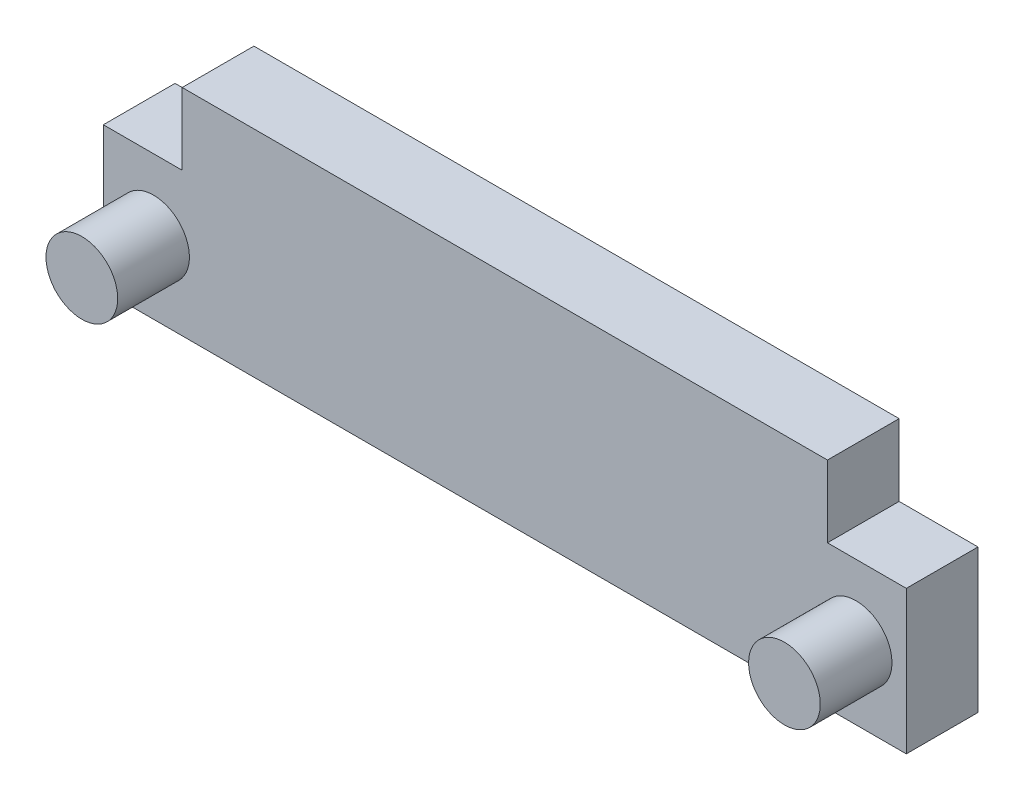
ISO-10303-21;
HEADER;
FILE_DESCRIPTION(('STEP AP214'),'2;1');
FILE_NAME('part.step','',(''),(''),'','','');
FILE_SCHEMA(('AUTOMOTIVE_DESIGN { 1 0 10303 214 1 1 1 1 }'));
ENDSEC;
DATA;
#1=APPLICATION_CONTEXT('core data for automotive mechanical design processes');
#2=APPLICATION_PROTOCOL_DEFINITION('international standard','automotive_design',2000,#1);
#3=PRODUCT_CONTEXT('',#1,'mechanical');
#4=PRODUCT('Part','Part','',(#3));
#5=PRODUCT_RELATED_PRODUCT_CATEGORY('part','',(#4));
#6=PRODUCT_DEFINITION_FORMATION('','',#4);
#7=PRODUCT_DEFINITION_CONTEXT('part definition',#1,'design');
#8=PRODUCT_DEFINITION('design','',#6,#7);
#9=PRODUCT_DEFINITION_SHAPE('','',#8);
#10=(LENGTH_UNIT() NAMED_UNIT(*) SI_UNIT(.MILLI.,.METRE.));
#11=(NAMED_UNIT(*) PLANE_ANGLE_UNIT() SI_UNIT($,.RADIAN.));
#12=(NAMED_UNIT(*) SI_UNIT($,.STERADIAN.) SOLID_ANGLE_UNIT());
#13=UNCERTAINTY_MEASURE_WITH_UNIT(LENGTH_MEASURE(1.E-05),#10,'distance_accuracy_value','');
#14=(GEOMETRIC_REPRESENTATION_CONTEXT(3) GLOBAL_UNCERTAINTY_ASSIGNED_CONTEXT((#13)) GLOBAL_UNIT_ASSIGNED_CONTEXT((#10,
#11,#12)) REPRESENTATION_CONTEXT('',''));
#15=CARTESIAN_POINT('',(0.,0.,0.));
#16=DIRECTION('',(0.,0.,1.));
#17=DIRECTION('',(1.,0.,0.));
#18=AXIS2_PLACEMENT_3D('',#15,#16,#17);
#19=CARTESIAN_POINT('',(45.,-15.,10.));
#20=DIRECTION('',(-1.,0.,0.));
#21=DIRECTION('',(0.,0.,1.));
#22=AXIS2_PLACEMENT_3D('',#19,#20,#21);
#23=PLANE('',#22);
#24=DIRECTION('',(0.,0.,1.));
#25=VECTOR('',#24,1.);
#26=CARTESIAN_POINT('',(45.,4.99999999999999,10.));
#27=LINE('',#26,#25);
#28=CARTESIAN_POINT('',(45.,4.99999999999999,0.));
#29=VERTEX_POINT('',#28);
#30=CARTESIAN_POINT('',(45.,4.99999999999999,10.));
#31=VERTEX_POINT('',#30);
#32=EDGE_CURVE('E57',#29,#31,#27,.T.);
#33=ORIENTED_EDGE('',*,*,#32,.F.);
#34=DIRECTION('',(0.,1.,0.));
#35=VECTOR('',#34,1.);
#36=CARTESIAN_POINT('',(45.,-15.,0.));
#37=LINE('',#36,#35);
#38=CARTESIAN_POINT('',(45.,15.,0.));
#39=VERTEX_POINT('',#38);
#40=EDGE_CURVE('E145',#29,#39,#37,.T.);
#41=ORIENTED_EDGE('',*,*,#40,.T.);
#42=DIRECTION('',(0.,0.,-1.));
#43=VECTOR('',#42,1.);
#44=CARTESIAN_POINT('',(45.,15.,10.));
#45=LINE('',#44,#43);
#46=CARTESIAN_POINT('',(45.,15.,10.));
#47=VERTEX_POINT('',#46);
#48=EDGE_CURVE('E42',#47,#39,#45,.T.);
#49=ORIENTED_EDGE('',*,*,#48,.F.);
#50=DIRECTION('',(0.,1.,0.));
#51=VECTOR('',#50,1.);
#52=CARTESIAN_POINT('',(45.,-15.,10.));
#53=LINE('',#52,#51);
#54=EDGE_CURVE('E146',#31,#47,#53,.T.);
#55=ORIENTED_EDGE('',*,*,#54,.F.);
#56=EDGE_LOOP('',(#33,#41,#49,#55));
#57=FACE_BOUND('',#56,.T.);
#58=ADVANCED_FACE('F35',(#57),#23,.F.);
#59=CARTESIAN_POINT('',(-45.,15.,10.));
#60=DIRECTION('',(0.,-1.,0.));
#61=DIRECTION('',(0.,0.,-1.));
#62=AXIS2_PLACEMENT_3D('',#59,#60,#61);
#63=PLANE('',#62);
#64=DIRECTION('',(-1.,0.,0.));
#65=VECTOR('',#64,1.);
#66=CARTESIAN_POINT('',(-45.,15.,0.));
#67=LINE('',#66,#65);
#68=CARTESIAN_POINT('',(-45.,15.,0.));
#69=VERTEX_POINT('',#68);
#70=EDGE_CURVE('E156',#39,#69,#67,.T.);
#71=ORIENTED_EDGE('',*,*,#70,.T.);
#72=DIRECTION('',(0.,0.,-1.));
#73=VECTOR('',#72,1.);
#74=CARTESIAN_POINT('',(-45.,15.,10.));
#75=LINE('',#74,#73);
#76=CARTESIAN_POINT('',(-45.,15.,10.));
#77=VERTEX_POINT('',#76);
#78=EDGE_CURVE('E154',#77,#69,#75,.T.);
#79=ORIENTED_EDGE('',*,*,#78,.F.);
#80=DIRECTION('',(-1.,0.,0.));
#81=VECTOR('',#80,1.);
#82=CARTESIAN_POINT('',(-45.,15.,10.));
#83=LINE('',#82,#81);
#84=EDGE_CURVE('E148',#47,#77,#83,.T.);
#85=ORIENTED_EDGE('',*,*,#84,.F.);
#86=ORIENTED_EDGE('',*,*,#48,.T.);
#87=EDGE_LOOP('',(#71,#79,#85,#86));
#88=FACE_BOUND('',#87,.T.);
#89=ADVANCED_FACE('F167',(#88),#63,.F.);
#90=CARTESIAN_POINT('',(-45.,-15.,10.));
#91=DIRECTION('',(1.,0.,0.));
#92=DIRECTION('',(0.,0.,-1.));
#93=AXIS2_PLACEMENT_3D('',#90,#91,#92);
#94=PLANE('',#93);
#95=DIRECTION('',(0.,-1.,0.));
#96=VECTOR('',#95,1.);
#97=CARTESIAN_POINT('',(-45.,-15.,0.));
#98=LINE('',#97,#96);
#99=CARTESIAN_POINT('',(-45.,4.99999999999999,0.));
#100=VERTEX_POINT('',#99);
#101=EDGE_CURVE('E158',#69,#100,#98,.T.);
#102=ORIENTED_EDGE('',*,*,#101,.T.);
#103=DIRECTION('',(0.,0.,1.));
#104=VECTOR('',#103,1.);
#105=CARTESIAN_POINT('',(-45.,4.99999999999999,10.));
#106=LINE('',#105,#104);
#107=CARTESIAN_POINT('',(-45.,4.99999999999999,10.));
#108=VERTEX_POINT('',#107);
#109=EDGE_CURVE('E116',#100,#108,#106,.T.);
#110=ORIENTED_EDGE('',*,*,#109,.T.);
#111=DIRECTION('',(0.,-1.,0.));
#112=VECTOR('',#111,1.);
#113=CARTESIAN_POINT('',(-45.,-15.,10.));
#114=LINE('',#113,#112);
#115=EDGE_CURVE('E105',#77,#108,#114,.T.);
#116=ORIENTED_EDGE('',*,*,#115,.F.);
#117=ORIENTED_EDGE('',*,*,#78,.T.);
#118=EDGE_LOOP('',(#102,#110,#116,#117));
#119=FACE_BOUND('',#118,.T.);
#120=ADVANCED_FACE('F175',(#119),#94,.F.);
#121=CARTESIAN_POINT('',(-45.,-15.,10.));
#122=DIRECTION('',(0.,1.,0.));
#123=DIRECTION('',(0.,0.,1.));
#124=AXIS2_PLACEMENT_3D('',#121,#122,#123);
#125=PLANE('',#124);
#126=DIRECTION('',(1.,0.,0.));
#127=VECTOR('',#126,1.);
#128=CARTESIAN_POINT('',(-45.,-15.,0.));
#129=LINE('',#128,#127);
#130=CARTESIAN_POINT('',(-56.,-15.,0.));
#131=VERTEX_POINT('',#130);
#132=CARTESIAN_POINT('',(56.,-15.,0.));
#133=VERTEX_POINT('',#132);
#134=EDGE_CURVE('E149',#131,#133,#129,.T.);
#135=ORIENTED_EDGE('',*,*,#134,.T.);
#136=DIRECTION('',(0.,0.,-1.));
#137=VECTOR('',#136,1.);
#138=CARTESIAN_POINT('',(56.,-15.,10.));
#139=LINE('',#138,#137);
#140=CARTESIAN_POINT('',(56.,-15.,10.));
#141=VERTEX_POINT('',#140);
#142=EDGE_CURVE('E131',#141,#133,#139,.T.);
#143=ORIENTED_EDGE('',*,*,#142,.F.);
#144=DIRECTION('',(1.,0.,0.));
#145=VECTOR('',#144,1.);
#146=CARTESIAN_POINT('',(-45.,-15.,10.));
#147=LINE('',#146,#145);
#148=CARTESIAN_POINT('',(-56.,-15.,10.));
#149=VERTEX_POINT('',#148);
#150=EDGE_CURVE('E152',#149,#141,#147,.T.);
#151=ORIENTED_EDGE('',*,*,#150,.F.);
#152=DIRECTION('',(0.,0.,-1.));
#153=VECTOR('',#152,1.);
#154=CARTESIAN_POINT('',(-56.,-15.,10.));
#155=LINE('',#154,#153);
#156=EDGE_CURVE('E115',#149,#131,#155,.T.);
#157=ORIENTED_EDGE('',*,*,#156,.T.);
#158=EDGE_LOOP('',(#135,#143,#151,#157));
#159=FACE_BOUND('',#158,.T.);
#160=ADVANCED_FACE('F177',(#159),#125,.F.);
#161=CARTESIAN_POINT('',(0.,0.,10.));
#162=DIRECTION('',(0.,0.,-1.));
#163=DIRECTION('',(-1.,0.,0.));
#164=AXIS2_PLACEMENT_3D('',#161,#162,#163);
#165=PLANE('',#164);
#166=CARTESIAN_POINT('',(49.,-5.00000000000001,10.));
#167=DIRECTION('',(0.,0.,-1.));
#168=DIRECTION('',(-1.,0.,0.));
#169=AXIS2_PLACEMENT_3D('',#166,#167,#168);
#170=CIRCLE('',#169,5.);
#171=CARTESIAN_POINT('',(44.,-5.00000000000001,10.));
#172=VERTEX_POINT('',#171);
#173=EDGE_CURVE('E322',#172,#172,#170,.T.);
#174=ORIENTED_EDGE('',*,*,#173,.T.);
#175=EDGE_LOOP('',(#174));
#176=FACE_BOUND('',#175,.T.);
#177=CARTESIAN_POINT('',(-49.,-5.00000000000001,10.));
#178=DIRECTION('',(0.,0.,-1.));
#179=DIRECTION('',(-1.,0.,0.));
#180=AXIS2_PLACEMENT_3D('',#177,#178,#179);
#181=CIRCLE('',#180,5.);
#182=CARTESIAN_POINT('',(-54.,-5.00000000000001,10.));
#183=VERTEX_POINT('',#182);
#184=EDGE_CURVE('E11',#183,#183,#181,.F.);
#185=ORIENTED_EDGE('',*,*,#184,.F.);
#186=EDGE_LOOP('',(#185));
#187=FACE_BOUND('',#186,.T.);
#188=ORIENTED_EDGE('',*,*,#150,.T.);
#189=DIRECTION('',(0.,-1.,0.));
#190=VECTOR('',#189,1.);
#191=CARTESIAN_POINT('',(56.,-15.,10.));
#192=LINE('',#191,#190);
#193=CARTESIAN_POINT('',(56.,4.99999999999999,10.));
#194=VERTEX_POINT('',#193);
#195=EDGE_CURVE('E128',#194,#141,#192,.T.);
#196=ORIENTED_EDGE('',*,*,#195,.F.);
#197=DIRECTION('',(-1.,0.,0.));
#198=VECTOR('',#197,1.);
#199=CARTESIAN_POINT('',(56.,4.99999999999999,10.));
#200=LINE('',#199,#198);
#201=EDGE_CURVE('E138',#194,#31,#200,.T.);
#202=ORIENTED_EDGE('',*,*,#201,.T.);
#203=ORIENTED_EDGE('',*,*,#54,.T.);
#204=ORIENTED_EDGE('',*,*,#84,.T.);
#205=ORIENTED_EDGE('',*,*,#115,.T.);
#206=DIRECTION('',(1.,0.,0.));
#207=VECTOR('',#206,1.);
#208=CARTESIAN_POINT('',(-56.,4.99999999999999,10.));
#209=LINE('',#208,#207);
#210=CARTESIAN_POINT('',(-56.,4.99999999999999,10.));
#211=VERTEX_POINT('',#210);
#212=EDGE_CURVE('E49',#211,#108,#209,.T.);
#213=ORIENTED_EDGE('',*,*,#212,.F.);
#214=DIRECTION('',(0.,-1.,0.));
#215=VECTOR('',#214,1.);
#216=CARTESIAN_POINT('',(-56.,-15.,10.));
#217=LINE('',#216,#215);
#218=EDGE_CURVE('E102',#211,#149,#217,.T.);
#219=ORIENTED_EDGE('',*,*,#218,.T.);
#220=EDGE_LOOP('',(#188,#196,#202,#203,#204,#205,#213,#219));
#221=FACE_BOUND('',#220,.T.);
#222=ADVANCED_FACE('F101',(#176,#187,#221),#165,.F.);
#223=CARTESIAN_POINT('',(0.,0.,0.));
#224=DIRECTION('',(0.,0.,-1.));
#225=DIRECTION('',(-1.,0.,0.));
#226=AXIS2_PLACEMENT_3D('',#223,#224,#225);
#227=PLANE('',#226);
#228=ORIENTED_EDGE('',*,*,#40,.F.);
#229=DIRECTION('',(-1.,0.,0.));
#230=VECTOR('',#229,1.);
#231=CARTESIAN_POINT('',(56.,4.99999999999999,0.));
#232=LINE('',#231,#230);
#233=CARTESIAN_POINT('',(56.,4.99999999999999,0.));
#234=VERTEX_POINT('',#233);
#235=EDGE_CURVE('E142',#234,#29,#232,.T.);
#236=ORIENTED_EDGE('',*,*,#235,.F.);
#237=DIRECTION('',(0.,1.,0.));
#238=VECTOR('',#237,1.);
#239=CARTESIAN_POINT('',(56.,-15.,0.));
#240=LINE('',#239,#238);
#241=EDGE_CURVE('E134',#133,#234,#240,.T.);
#242=ORIENTED_EDGE('',*,*,#241,.F.);
#243=ORIENTED_EDGE('',*,*,#134,.F.);
#244=DIRECTION('',(0.,1.,0.));
#245=VECTOR('',#244,1.);
#246=CARTESIAN_POINT('',(-56.,-15.,0.));
#247=LINE('',#246,#245);
#248=CARTESIAN_POINT('',(-56.,4.99999999999999,0.));
#249=VERTEX_POINT('',#248);
#250=EDGE_CURVE('E119',#131,#249,#247,.T.);
#251=ORIENTED_EDGE('',*,*,#250,.T.);
#252=DIRECTION('',(1.,0.,0.));
#253=VECTOR('',#252,1.);
#254=CARTESIAN_POINT('',(-56.,4.99999999999999,0.));
#255=LINE('',#254,#253);
#256=EDGE_CURVE('E106',#249,#100,#255,.T.);
#257=ORIENTED_EDGE('',*,*,#256,.T.);
#258=ORIENTED_EDGE('',*,*,#101,.F.);
#259=ORIENTED_EDGE('',*,*,#70,.F.);
#260=EDGE_LOOP('',(#228,#236,#242,#243,#251,#257,#258,#259));
#261=FACE_BOUND('',#260,.T.);
#262=ADVANCED_FACE('F173',(#261),#227,.T.);
#263=CARTESIAN_POINT('',(56.,4.99999999999999,10.));
#264=DIRECTION('',(0.,-1.,0.));
#265=DIRECTION('',(0.,0.,-1.));
#266=AXIS2_PLACEMENT_3D('',#263,#264,#265);
#267=PLANE('',#266);
#268=ORIENTED_EDGE('',*,*,#32,.T.);
#269=ORIENTED_EDGE('',*,*,#201,.F.);
#270=DIRECTION('',(0.,0.,1.));
#271=VECTOR('',#270,1.);
#272=CARTESIAN_POINT('',(56.,4.99999999999999,10.));
#273=LINE('',#272,#271);
#274=EDGE_CURVE('E136',#234,#194,#273,.T.);
#275=ORIENTED_EDGE('',*,*,#274,.F.);
#276=ORIENTED_EDGE('',*,*,#235,.T.);
#277=EDGE_LOOP('',(#268,#269,#275,#276));
#278=FACE_BOUND('',#277,.T.);
#279=ADVANCED_FACE('F225',(#278),#267,.F.);
#280=CARTESIAN_POINT('',(56.,0.,0.));
#281=DIRECTION('',(-1.,0.,0.));
#282=DIRECTION('',(0.,0.,1.));
#283=AXIS2_PLACEMENT_3D('',#280,#281,#282);
#284=PLANE('',#283);
#285=ORIENTED_EDGE('',*,*,#195,.T.);
#286=ORIENTED_EDGE('',*,*,#142,.T.);
#287=ORIENTED_EDGE('',*,*,#241,.T.);
#288=ORIENTED_EDGE('',*,*,#274,.T.);
#289=EDGE_LOOP('',(#285,#286,#287,#288));
#290=FACE_BOUND('',#289,.T.);
#291=ADVANCED_FACE('F241',(#290),#284,.F.);
#292=CARTESIAN_POINT('',(-56.,4.99999999999999,10.));
#293=DIRECTION('',(0.,1.,0.));
#294=DIRECTION('',(0.,0.,1.));
#295=AXIS2_PLACEMENT_3D('',#292,#293,#294);
#296=PLANE('',#295);
#297=ORIENTED_EDGE('',*,*,#109,.F.);
#298=ORIENTED_EDGE('',*,*,#256,.F.);
#299=DIRECTION('',(0.,0.,1.));
#300=VECTOR('',#299,1.);
#301=CARTESIAN_POINT('',(-56.,4.99999999999999,10.));
#302=LINE('',#301,#300);
#303=EDGE_CURVE('E112',#249,#211,#302,.T.);
#304=ORIENTED_EDGE('',*,*,#303,.T.);
#305=ORIENTED_EDGE('',*,*,#212,.T.);
#306=EDGE_LOOP('',(#297,#298,#304,#305));
#307=FACE_BOUND('',#306,.T.);
#308=ADVANCED_FACE('F118',(#307),#296,.T.);
#309=CARTESIAN_POINT('',(-56.,0.,0.));
#310=DIRECTION('',(1.,0.,0.));
#311=DIRECTION('',(0.,0.,1.));
#312=AXIS2_PLACEMENT_3D('',#309,#310,#311);
#313=PLANE('',#312);
#314=ORIENTED_EDGE('',*,*,#218,.F.);
#315=ORIENTED_EDGE('',*,*,#303,.F.);
#316=ORIENTED_EDGE('',*,*,#250,.F.);
#317=ORIENTED_EDGE('',*,*,#156,.F.);
#318=EDGE_LOOP('',(#314,#315,#316,#317));
#319=FACE_BOUND('',#318,.T.);
#320=ADVANCED_FACE('F110',(#319),#313,.F.);
#321=CARTESIAN_POINT('',(-49.,-5.00000000000001,20.));
#322=DIRECTION('',(0.,0.,-1.));
#323=DIRECTION('',(-1.,0.,0.));
#324=AXIS2_PLACEMENT_3D('',#321,#322,#323);
#325=CYLINDRICAL_SURFACE('',#324,5.);
#326=CARTESIAN_POINT('',(-49.,-5.00000000000001,20.));
#327=DIRECTION('',(0.,0.,1.));
#328=DIRECTION('',(1.,0.,0.));
#329=AXIS2_PLACEMENT_3D('',#326,#327,#328);
#330=CIRCLE('',#329,5.);
#331=CARTESIAN_POINT('',(-44.,-5.00000000000001,20.));
#332=VERTEX_POINT('',#331);
#333=EDGE_CURVE('E126',#332,#332,#330,.T.);
#334=ORIENTED_EDGE('',*,*,#333,.F.);
#335=EDGE_LOOP('',(#334));
#336=FACE_BOUND('',#335,.T.);
#337=ORIENTED_EDGE('',*,*,#184,.T.);
#338=EDGE_LOOP('',(#337));
#339=FACE_BOUND('',#338,.T.);
#340=ADVANCED_FACE('F275',(#336,#339),#325,.T.);
#341=CARTESIAN_POINT('',(-49.,-5.00000000000001,20.));
#342=DIRECTION('',(0.,0.,1.));
#343=DIRECTION('',(1.,0.,0.));
#344=AXIS2_PLACEMENT_3D('',#341,#342,#343);
#345=PLANE('',#344);
#346=ORIENTED_EDGE('',*,*,#333,.T.);
#347=EDGE_LOOP('',(#346));
#348=FACE_BOUND('',#347,.T.);
#349=ADVANCED_FACE('F282',(#348),#345,.T.);
#350=CARTESIAN_POINT('',(49.,-5.00000000000001,20.));
#351=DIRECTION('',(0.,0.,-1.));
#352=DIRECTION('',(-1.,0.,0.));
#353=AXIS2_PLACEMENT_3D('',#350,#351,#352);
#354=CYLINDRICAL_SURFACE('',#353,5.);
#355=CARTESIAN_POINT('',(49.,-5.00000000000001,20.));
#356=DIRECTION('',(0.,0.,-1.));
#357=DIRECTION('',(-1.,0.,0.));
#358=AXIS2_PLACEMENT_3D('',#355,#356,#357);
#359=CIRCLE('',#358,5.);
#360=CARTESIAN_POINT('',(44.,-5.00000000000001,20.));
#361=VERTEX_POINT('',#360);
#362=EDGE_CURVE('E321',#361,#361,#359,.T.);
#363=ORIENTED_EDGE('',*,*,#362,.T.);
#364=EDGE_LOOP('',(#363));
#365=FACE_BOUND('',#364,.T.);
#366=ORIENTED_EDGE('',*,*,#173,.F.);
#367=EDGE_LOOP('',(#366));
#368=FACE_BOUND('',#367,.T.);
#369=ADVANCED_FACE('F289',(#365,#368),#354,.T.);
#370=CARTESIAN_POINT('',(49.,-5.00000000000001,20.));
#371=DIRECTION('',(0.,0.,1.));
#372=DIRECTION('',(-1.,0.,0.));
#373=AXIS2_PLACEMENT_3D('',#370,#371,#372);
#374=PLANE('',#373);
#375=ORIENTED_EDGE('',*,*,#362,.F.);
#376=EDGE_LOOP('',(#375));
#377=FACE_BOUND('',#376,.T.);
#378=ADVANCED_FACE('F296',(#377),#374,.T.);
#379=CLOSED_SHELL('',(#58,#89,#120,#160,#222,#262,#279,#291,#308,#320,#340,#349,#369,#378));
#380=MANIFOLD_SOLID_BREP('B2',#379);
#381=ADVANCED_BREP_SHAPE_REPRESENTATION('',(#18,#380),#14);
#382=SHAPE_DEFINITION_REPRESENTATION(#9,#381);
ENDSEC;
END-ISO-10303-21;
